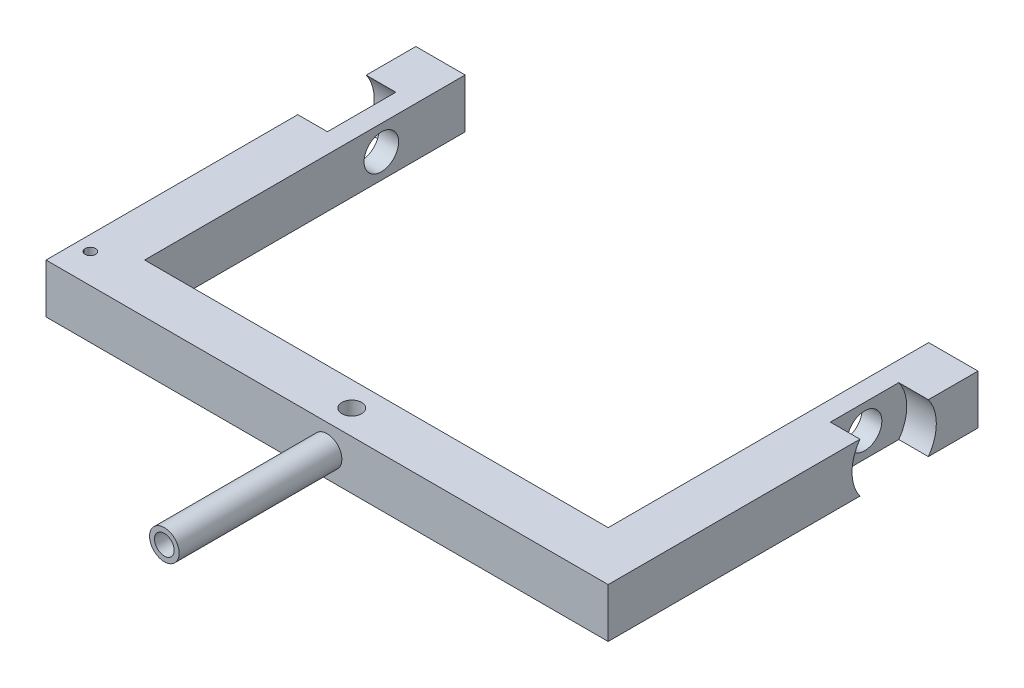
ISO-10303-21;
HEADER;
FILE_DESCRIPTION(('STEP AP214'),'2;1');
FILE_NAME('part.step','',(''),(''),'','','');
FILE_SCHEMA(('AUTOMOTIVE_DESIGN { 1 0 10303 214 1 1 1 1 }'));
ENDSEC;
DATA;
#1=APPLICATION_CONTEXT('core data for automotive mechanical design processes');
#2=APPLICATION_PROTOCOL_DEFINITION('international standard','automotive_design',2000,#1);
#3=PRODUCT_CONTEXT('',#1,'mechanical');
#4=PRODUCT('Part','Part','',(#3));
#5=PRODUCT_RELATED_PRODUCT_CATEGORY('part','',(#4));
#6=PRODUCT_DEFINITION_FORMATION('','',#4);
#7=PRODUCT_DEFINITION_CONTEXT('part definition',#1,'design');
#8=PRODUCT_DEFINITION('design','',#6,#7);
#9=PRODUCT_DEFINITION_SHAPE('','',#8);
#10=(LENGTH_UNIT() NAMED_UNIT(*) SI_UNIT(.MILLI.,.METRE.));
#11=(NAMED_UNIT(*) PLANE_ANGLE_UNIT() SI_UNIT($,.RADIAN.));
#12=(NAMED_UNIT(*) SI_UNIT($,.STERADIAN.) SOLID_ANGLE_UNIT());
#13=UNCERTAINTY_MEASURE_WITH_UNIT(LENGTH_MEASURE(1.E-05),#10,'distance_accuracy_value','');
#14=(GEOMETRIC_REPRESENTATION_CONTEXT(3) GLOBAL_UNCERTAINTY_ASSIGNED_CONTEXT((#13)) GLOBAL_UNIT_ASSIGNED_CONTEXT((#10,
#11,#12)) REPRESENTATION_CONTEXT('',''));
#15=CARTESIAN_POINT('',(0.,0.,0.));
#16=DIRECTION('',(0.,0.,1.));
#17=DIRECTION('',(1.,0.,0.));
#18=AXIS2_PLACEMENT_3D('',#15,#16,#17);
#19=CARTESIAN_POINT('',(-57.,10.,10.));
#20=DIRECTION('',(1.,0.,0.));
#21=DIRECTION('',(0.,0.,-1.));
#22=AXIS2_PLACEMENT_3D('',#19,#20,#21);
#23=PLANE('',#22);
#24=CARTESIAN_POINT('',(-57.,5.,-48.));
#25=DIRECTION('',(1.,0.,0.));
#26=DIRECTION('',(0.,0.,-1.));
#27=AXIS2_PLACEMENT_3D('',#24,#25,#26);
#28=CIRCLE('',#27,8.55);
#29=CARTESIAN_POINT('',(-57.,10.,-41.0644034142693));
#30=VERTEX_POINT('',#29);
#31=CARTESIAN_POINT('',(-57.,0.,-41.0644034142693));
#32=VERTEX_POINT('',#31);
#33=EDGE_CURVE('E175',#30,#32,#28,.T.);
#34=ORIENTED_EDGE('',*,*,#33,.T.);
#35=DIRECTION('',(0.,0.,1.));
#36=VECTOR('',#35,1.);
#37=CARTESIAN_POINT('',(-57.,0.,10.));
#38=LINE('',#37,#36);
#39=CARTESIAN_POINT('',(-57.,0.,10.));
#40=VERTEX_POINT('',#39);
#41=EDGE_CURVE('E206',#32,#40,#38,.T.);
#42=ORIENTED_EDGE('',*,*,#41,.T.);
#43=DIRECTION('',(0.,-1.,0.));
#44=VECTOR('',#43,1.);
#45=CARTESIAN_POINT('',(-57.,10.,10.));
#46=LINE('',#45,#44);
#47=CARTESIAN_POINT('',(-57.,10.,10.));
#48=VERTEX_POINT('',#47);
#49=EDGE_CURVE('E235',#48,#40,#46,.T.);
#50=ORIENTED_EDGE('',*,*,#49,.F.);
#51=DIRECTION('',(0.,0.,1.));
#52=VECTOR('',#51,1.);
#53=CARTESIAN_POINT('',(-57.,10.,10.));
#54=LINE('',#53,#52);
#55=EDGE_CURVE('E183',#30,#48,#54,.T.);
#56=ORIENTED_EDGE('',*,*,#55,.F.);
#57=EDGE_LOOP('',(#34,#42,#50,#56));
#58=FACE_BOUND('',#57,.T.);
#59=ADVANCED_FACE('F33',(#58),#23,.F.);
#60=CARTESIAN_POINT('',(0.,10.,0.));
#61=DIRECTION('',(0.,1.,0.));
#62=DIRECTION('',(0.,0.,1.));
#63=AXIS2_PLACEMENT_3D('',#60,#61,#62);
#64=PLANE('',#63);
#65=CARTESIAN_POINT('',(0.,10.,5.00000000000001));
#66=DIRECTION('',(0.,1.,0.));
#67=DIRECTION('',(0.,0.,1.));
#68=AXIS2_PLACEMENT_3D('',#65,#66,#67);
#69=CIRCLE('',#68,2.);
#70=CARTESIAN_POINT('',(0.,10.,7.00000000000001));
#71=VERTEX_POINT('',#70);
#72=EDGE_CURVE('E414',#71,#71,#69,.T.);
#73=ORIENTED_EDGE('',*,*,#72,.F.);
#74=EDGE_LOOP('',(#73));
#75=FACE_BOUND('',#74,.T.);
#76=CARTESIAN_POINT('',(-54.,10.,4.00000000000001));
#77=DIRECTION('',(0.,1.,0.));
#78=DIRECTION('',(0.,0.,1.));
#79=AXIS2_PLACEMENT_3D('',#76,#77,#78);
#80=CIRCLE('',#79,1.05);
#81=CARTESIAN_POINT('',(-54.,10.,5.05000000000001));
#82=VERTEX_POINT('',#81);
#83=EDGE_CURVE('E405',#82,#82,#80,.T.);
#84=ORIENTED_EDGE('',*,*,#83,.F.);
#85=EDGE_LOOP('',(#84));
#86=FACE_BOUND('',#85,.T.);
#87=CARTESIAN_POINT('',(-57.,10.,-65.));
#88=VERTEX_POINT('',#87);
#89=CARTESIAN_POINT('',(-57.,10.,-54.9355965857308));
#90=VERTEX_POINT('',#89);
#91=EDGE_CURVE('E172',#88,#90,#54,.T.);
#92=ORIENTED_EDGE('',*,*,#91,.T.);
#93=DIRECTION('',(-1.,0.,0.));
#94=VECTOR('',#93,1.);
#95=CARTESIAN_POINT('',(-51.,10.,-54.9355965857308));
#96=LINE('',#95,#94);
#97=CARTESIAN_POINT('',(-51.,10.,-54.9355965857308));
#98=VERTEX_POINT('',#97);
#99=EDGE_CURVE('E154',#90,#98,#96,.F.);
#100=ORIENTED_EDGE('',*,*,#99,.T.);
#101=DIRECTION('',(0.,0.,1.));
#102=VECTOR('',#101,1.);
#103=CARTESIAN_POINT('',(-51.,10.,0.));
#104=LINE('',#103,#102);
#105=CARTESIAN_POINT('',(-51.,10.,-41.0644034142693));
#106=VERTEX_POINT('',#105);
#107=EDGE_CURVE('E372',#98,#106,#104,.T.);
#108=ORIENTED_EDGE('',*,*,#107,.T.);
#109=DIRECTION('',(-1.,0.,0.));
#110=VECTOR('',#109,1.);
#111=CARTESIAN_POINT('',(-51.,10.,-41.0644034142693));
#112=LINE('',#111,#110);
#113=EDGE_CURVE('E165',#106,#30,#112,.T.);
#114=ORIENTED_EDGE('',*,*,#113,.T.);
#115=ORIENTED_EDGE('',*,*,#55,.T.);
#116=DIRECTION('',(1.,0.,0.));
#117=VECTOR('',#116,1.);
#118=CARTESIAN_POINT('',(57.,10.,10.));
#119=LINE('',#118,#117);
#120=CARTESIAN_POINT('',(57.,10.,10.));
#121=VERTEX_POINT('',#120);
#122=EDGE_CURVE('E182',#48,#121,#119,.T.);
#123=ORIENTED_EDGE('',*,*,#122,.T.);
#124=DIRECTION('',(0.,0.,-1.));
#125=VECTOR('',#124,1.);
#126=CARTESIAN_POINT('',(57.,10.,-65.));
#127=LINE('',#126,#125);
#128=CARTESIAN_POINT('',(57.,10.,-41.0644034142693));
#129=VERTEX_POINT('',#128);
#130=EDGE_CURVE('E190',#121,#129,#127,.T.);
#131=ORIENTED_EDGE('',*,*,#130,.T.);
#132=DIRECTION('',(1.,0.,0.));
#133=VECTOR('',#132,1.);
#134=CARTESIAN_POINT('',(51.,10.,-41.0644034142693));
#135=LINE('',#134,#133);
#136=CARTESIAN_POINT('',(51.,10.,-41.0644034142693));
#137=VERTEX_POINT('',#136);
#138=EDGE_CURVE('E204',#137,#129,#135,.T.);
#139=ORIENTED_EDGE('',*,*,#138,.F.);
#140=DIRECTION('',(0.,0.,-1.));
#141=VECTOR('',#140,1.);
#142=CARTESIAN_POINT('',(51.,10.,0.));
#143=LINE('',#142,#141);
#144=CARTESIAN_POINT('',(51.,10.,-54.9355965857308));
#145=VERTEX_POINT('',#144);
#146=EDGE_CURVE('E384',#137,#145,#143,.T.);
#147=ORIENTED_EDGE('',*,*,#146,.T.);
#148=DIRECTION('',(1.,0.,0.));
#149=VECTOR('',#148,1.);
#150=CARTESIAN_POINT('',(51.,10.,-54.9355965857308));
#151=LINE('',#150,#149);
#152=CARTESIAN_POINT('',(57.,10.,-54.9355965857308));
#153=VERTEX_POINT('',#152);
#154=EDGE_CURVE('E386',#153,#145,#151,.F.);
#155=ORIENTED_EDGE('',*,*,#154,.F.);
#156=CARTESIAN_POINT('',(57.,10.,-65.));
#157=VERTEX_POINT('',#156);
#158=EDGE_CURVE('E185',#153,#157,#127,.T.);
#159=ORIENTED_EDGE('',*,*,#158,.T.);
#160=DIRECTION('',(-1.,0.,0.));
#161=VECTOR('',#160,1.);
#162=CARTESIAN_POINT('',(47.,10.,-65.));
#163=LINE('',#162,#161);
#164=CARTESIAN_POINT('',(47.,10.,-65.));
#165=VERTEX_POINT('',#164);
#166=EDGE_CURVE('E193',#157,#165,#163,.T.);
#167=ORIENTED_EDGE('',*,*,#166,.T.);
#168=DIRECTION('',(0.,0.,1.));
#169=VECTOR('',#168,1.);
#170=CARTESIAN_POINT('',(47.,10.,0.));
#171=LINE('',#170,#169);
#172=CARTESIAN_POINT('',(47.,10.,0.));
#173=VERTEX_POINT('',#172);
#174=EDGE_CURVE('E195',#165,#173,#171,.T.);
#175=ORIENTED_EDGE('',*,*,#174,.T.);
#176=DIRECTION('',(-1.,0.,0.));
#177=VECTOR('',#176,1.);
#178=CARTESIAN_POINT('',(-47.,10.,0.));
#179=LINE('',#178,#177);
#180=CARTESIAN_POINT('',(-47.,10.,0.));
#181=VERTEX_POINT('',#180);
#182=EDGE_CURVE('E197',#173,#181,#179,.T.);
#183=ORIENTED_EDGE('',*,*,#182,.T.);
#184=DIRECTION('',(0.,0.,-1.));
#185=VECTOR('',#184,1.);
#186=CARTESIAN_POINT('',(-47.,10.,-65.));
#187=LINE('',#186,#185);
#188=CARTESIAN_POINT('',(-47.,10.,-65.));
#189=VERTEX_POINT('',#188);
#190=EDGE_CURVE('E220',#181,#189,#187,.T.);
#191=ORIENTED_EDGE('',*,*,#190,.T.);
#192=DIRECTION('',(-1.,0.,0.));
#193=VECTOR('',#192,1.);
#194=CARTESIAN_POINT('',(-57.,10.,-65.));
#195=LINE('',#194,#193);
#196=EDGE_CURVE('E180',#189,#88,#195,.T.);
#197=ORIENTED_EDGE('',*,*,#196,.T.);
#198=EDGE_LOOP('',(#92,#100,#108,#114,#115,#123,#131,#139,#147,#155,#159,#167,#175,#183,#191,#197));
#199=FACE_BOUND('',#198,.T.);
#200=ADVANCED_FACE('F178',(#75,#86,#199),#64,.T.);
#201=CARTESIAN_POINT('',(0.,0.,0.));
#202=DIRECTION('',(0.,1.,0.));
#203=DIRECTION('',(0.,0.,1.));
#204=AXIS2_PLACEMENT_3D('',#201,#202,#203);
#205=PLANE('',#204);
#206=CARTESIAN_POINT('',(-54.,0.,4.00000000000001));
#207=DIRECTION('',(0.,1.,0.));
#208=DIRECTION('',(0.,0.,1.));
#209=AXIS2_PLACEMENT_3D('',#206,#207,#208);
#210=CIRCLE('',#209,1.05);
#211=CARTESIAN_POINT('',(-54.,0.,5.05000000000001));
#212=VERTEX_POINT('',#211);
#213=EDGE_CURVE('E404',#212,#212,#210,.T.);
#214=ORIENTED_EDGE('',*,*,#213,.T.);
#215=EDGE_LOOP('',(#214));
#216=FACE_BOUND('',#215,.T.);
#217=DIRECTION('',(-1.,0.,0.));
#218=VECTOR('',#217,1.);
#219=CARTESIAN_POINT('',(-51.,0.,-54.9355965857308));
#220=LINE('',#219,#218);
#221=CARTESIAN_POINT('',(-57.,0.,-54.9355965857308));
#222=VERTEX_POINT('',#221);
#223=CARTESIAN_POINT('',(-51.,0.,-54.9355965857308));
#224=VERTEX_POINT('',#223);
#225=EDGE_CURVE('E255',#222,#224,#220,.F.);
#226=ORIENTED_EDGE('',*,*,#225,.F.);
#227=CARTESIAN_POINT('',(-57.,0.,-65.));
#228=VERTEX_POINT('',#227);
#229=EDGE_CURVE('E174',#228,#222,#38,.T.);
#230=ORIENTED_EDGE('',*,*,#229,.F.);
#231=DIRECTION('',(-1.,0.,0.));
#232=VECTOR('',#231,1.);
#233=CARTESIAN_POINT('',(-57.,0.,-65.));
#234=LINE('',#233,#232);
#235=CARTESIAN_POINT('',(-47.,0.,-65.));
#236=VERTEX_POINT('',#235);
#237=EDGE_CURVE('E203',#236,#228,#234,.T.);
#238=ORIENTED_EDGE('',*,*,#237,.F.);
#239=DIRECTION('',(0.,0.,-1.));
#240=VECTOR('',#239,1.);
#241=CARTESIAN_POINT('',(-47.,0.,-65.));
#242=LINE('',#241,#240);
#243=CARTESIAN_POINT('',(-47.,0.,0.));
#244=VERTEX_POINT('',#243);
#245=EDGE_CURVE('E200',#244,#236,#242,.T.);
#246=ORIENTED_EDGE('',*,*,#245,.F.);
#247=DIRECTION('',(-1.,0.,0.));
#248=VECTOR('',#247,1.);
#249=CARTESIAN_POINT('',(-47.,0.,0.));
#250=LINE('',#249,#248);
#251=CARTESIAN_POINT('',(47.,0.,0.));
#252=VERTEX_POINT('',#251);
#253=EDGE_CURVE('E218',#252,#244,#250,.T.);
#254=ORIENTED_EDGE('',*,*,#253,.F.);
#255=DIRECTION('',(0.,0.,1.));
#256=VECTOR('',#255,1.);
#257=CARTESIAN_POINT('',(47.,0.,0.));
#258=LINE('',#257,#256);
#259=CARTESIAN_POINT('',(47.,0.,-65.));
#260=VERTEX_POINT('',#259);
#261=EDGE_CURVE('E216',#260,#252,#258,.T.);
#262=ORIENTED_EDGE('',*,*,#261,.F.);
#263=DIRECTION('',(-1.,0.,0.));
#264=VECTOR('',#263,1.);
#265=CARTESIAN_POINT('',(47.,0.,-65.));
#266=LINE('',#265,#264);
#267=CARTESIAN_POINT('',(57.,0.,-65.));
#268=VERTEX_POINT('',#267);
#269=EDGE_CURVE('E214',#268,#260,#266,.T.);
#270=ORIENTED_EDGE('',*,*,#269,.F.);
#271=DIRECTION('',(0.,0.,-1.));
#272=VECTOR('',#271,1.);
#273=CARTESIAN_POINT('',(57.,0.,-65.));
#274=LINE('',#273,#272);
#275=CARTESIAN_POINT('',(57.,0.,-54.9355965857308));
#276=VERTEX_POINT('',#275);
#277=EDGE_CURVE('E210',#276,#268,#274,.T.);
#278=ORIENTED_EDGE('',*,*,#277,.F.);
#279=DIRECTION('',(1.,0.,0.));
#280=VECTOR('',#279,1.);
#281=CARTESIAN_POINT('',(51.,0.,-54.9355965857308));
#282=LINE('',#281,#280);
#283=CARTESIAN_POINT('',(51.,0.,-54.9355965857308));
#284=VERTEX_POINT('',#283);
#285=EDGE_CURVE('E245',#276,#284,#282,.F.);
#286=ORIENTED_EDGE('',*,*,#285,.T.);
#287=DIRECTION('',(0.,0.,-1.));
#288=VECTOR('',#287,1.);
#289=CARTESIAN_POINT('',(51.,0.,0.));
#290=LINE('',#289,#288);
#291=CARTESIAN_POINT('',(51.,0.,-41.0644034142693));
#292=VERTEX_POINT('',#291);
#293=EDGE_CURVE('E243',#292,#284,#290,.T.);
#294=ORIENTED_EDGE('',*,*,#293,.F.);
#295=DIRECTION('',(1.,0.,0.));
#296=VECTOR('',#295,1.);
#297=CARTESIAN_POINT('',(51.,0.,-41.0644034142693));
#298=LINE('',#297,#296);
#299=CARTESIAN_POINT('',(57.,0.,-41.0644034142693));
#300=VERTEX_POINT('',#299);
#301=EDGE_CURVE('E248',#292,#300,#298,.T.);
#302=ORIENTED_EDGE('',*,*,#301,.T.);
#303=CARTESIAN_POINT('',(57.,0.,10.));
#304=VERTEX_POINT('',#303);
#305=EDGE_CURVE('E211',#304,#300,#274,.T.);
#306=ORIENTED_EDGE('',*,*,#305,.F.);
#307=DIRECTION('',(1.,0.,0.));
#308=VECTOR('',#307,1.);
#309=CARTESIAN_POINT('',(57.,0.,10.));
#310=LINE('',#309,#308);
#311=EDGE_CURVE('E208',#40,#304,#310,.T.);
#312=ORIENTED_EDGE('',*,*,#311,.F.);
#313=ORIENTED_EDGE('',*,*,#41,.F.);
#314=DIRECTION('',(-1.,0.,0.));
#315=VECTOR('',#314,1.);
#316=CARTESIAN_POINT('',(-51.,0.,-41.0644034142693));
#317=LINE('',#316,#315);
#318=CARTESIAN_POINT('',(-51.,0.,-41.0644034142693));
#319=VERTEX_POINT('',#318);
#320=EDGE_CURVE('E253',#319,#32,#317,.T.);
#321=ORIENTED_EDGE('',*,*,#320,.F.);
#322=DIRECTION('',(0.,0.,1.));
#323=VECTOR('',#322,1.);
#324=CARTESIAN_POINT('',(-51.,0.,0.));
#325=LINE('',#324,#323);
#326=EDGE_CURVE('E251',#224,#319,#325,.T.);
#327=ORIENTED_EDGE('',*,*,#326,.F.);
#328=EDGE_LOOP('',(#226,#230,#238,#246,#254,#262,#270,#278,#286,#294,#302,#306,#312,#313,#321,#327));
#329=FACE_BOUND('',#328,.T.);
#330=ADVANCED_FACE('F310',(#216,#329),#205,.F.);
#331=CARTESIAN_POINT('',(57.,10.,-65.));
#332=DIRECTION('',(-1.,0.,0.));
#333=DIRECTION('',(0.,0.,1.));
#334=AXIS2_PLACEMENT_3D('',#331,#332,#333);
#335=PLANE('',#334);
#336=ORIENTED_EDGE('',*,*,#158,.F.);
#337=CARTESIAN_POINT('',(57.,5.,-48.));
#338=DIRECTION('',(1.,0.,0.));
#339=DIRECTION('',(0.,0.,-1.));
#340=AXIS2_PLACEMENT_3D('',#337,#338,#339);
#341=CIRCLE('',#340,8.55);
#342=EDGE_CURVE('E164',#276,#153,#341,.T.);
#343=ORIENTED_EDGE('',*,*,#342,.F.);
#344=ORIENTED_EDGE('',*,*,#277,.T.);
#345=DIRECTION('',(0.,-1.,0.));
#346=VECTOR('',#345,1.);
#347=CARTESIAN_POINT('',(57.,10.,-65.));
#348=LINE('',#347,#346);
#349=EDGE_CURVE('E229',#157,#268,#348,.T.);
#350=ORIENTED_EDGE('',*,*,#349,.F.);
#351=EDGE_LOOP('',(#336,#343,#344,#350));
#352=FACE_BOUND('',#351,.T.);
#353=ADVANCED_FACE('F314',(#352),#335,.F.);
#354=CARTESIAN_POINT('',(-47.,10.,-65.));
#355=DIRECTION('',(-1.,0.,0.));
#356=DIRECTION('',(0.,0.,1.));
#357=AXIS2_PLACEMENT_3D('',#354,#355,#356);
#358=PLANE('',#357);
#359=CARTESIAN_POINT('',(-47.,5.,-48.));
#360=DIRECTION('',(-1.,0.,0.));
#361=DIRECTION('',(0.,0.,1.));
#362=AXIS2_PLACEMENT_3D('',#359,#360,#361);
#363=CIRCLE('',#362,3.5);
#364=CARTESIAN_POINT('',(-47.,5.,-44.5));
#365=VERTEX_POINT('',#364);
#366=EDGE_CURVE('E176',#365,#365,#363,.T.);
#367=ORIENTED_EDGE('',*,*,#366,.T.);
#368=EDGE_LOOP('',(#367));
#369=FACE_BOUND('',#368,.T.);
#370=ORIENTED_EDGE('',*,*,#245,.T.);
#371=DIRECTION('',(0.,-1.,0.));
#372=VECTOR('',#371,1.);
#373=CARTESIAN_POINT('',(-47.,10.,-65.));
#374=LINE('',#373,#372);
#375=EDGE_CURVE('E240',#189,#236,#374,.T.);
#376=ORIENTED_EDGE('',*,*,#375,.F.);
#377=ORIENTED_EDGE('',*,*,#190,.F.);
#378=DIRECTION('',(0.,-1.,0.));
#379=VECTOR('',#378,1.);
#380=CARTESIAN_POINT('',(-47.,10.,0.));
#381=LINE('',#380,#379);
#382=EDGE_CURVE('E199',#181,#244,#381,.T.);
#383=ORIENTED_EDGE('',*,*,#382,.T.);
#384=EDGE_LOOP('',(#370,#376,#377,#383));
#385=FACE_BOUND('',#384,.T.);
#386=ADVANCED_FACE('F339',(#369,#385),#358,.F.);
#387=CARTESIAN_POINT('',(-57.,10.,-65.));
#388=DIRECTION('',(0.,0.,1.));
#389=DIRECTION('',(1.,0.,0.));
#390=AXIS2_PLACEMENT_3D('',#387,#388,#389);
#391=PLANE('',#390);
#392=ORIENTED_EDGE('',*,*,#237,.T.);
#393=DIRECTION('',(0.,-1.,0.));
#394=VECTOR('',#393,1.);
#395=CARTESIAN_POINT('',(-57.,10.,-65.));
#396=LINE('',#395,#394);
#397=EDGE_CURVE('E238',#88,#228,#396,.T.);
#398=ORIENTED_EDGE('',*,*,#397,.F.);
#399=ORIENTED_EDGE('',*,*,#196,.F.);
#400=ORIENTED_EDGE('',*,*,#375,.T.);
#401=EDGE_LOOP('',(#392,#398,#399,#400));
#402=FACE_BOUND('',#401,.T.);
#403=ADVANCED_FACE('F337',(#402),#391,.F.);
#404=EDGE_CURVE('E158',#222,#90,#28,.T.);
#405=ORIENTED_EDGE('',*,*,#404,.T.);
#406=ORIENTED_EDGE('',*,*,#91,.F.);
#407=ORIENTED_EDGE('',*,*,#397,.T.);
#408=ORIENTED_EDGE('',*,*,#229,.T.);
#409=EDGE_LOOP('',(#405,#406,#407,#408));
#410=FACE_BOUND('',#409,.T.);
#411=ADVANCED_FACE('F170',(#410),#23,.F.);
#412=CARTESIAN_POINT('',(57.,10.,10.));
#413=DIRECTION('',(0.,0.,-1.));
#414=DIRECTION('',(-1.,0.,0.));
#415=AXIS2_PLACEMENT_3D('',#412,#413,#414);
#416=PLANE('',#415);
#417=CARTESIAN_POINT('',(0.,5.,10.));
#418=DIRECTION('',(0.,0.,-1.));
#419=DIRECTION('',(-1.,0.,0.));
#420=AXIS2_PLACEMENT_3D('',#417,#418,#419);
#421=CIRCLE('',#420,3.);
#422=CARTESIAN_POINT('',(-3.,5.,10.));
#423=VERTEX_POINT('',#422);
#424=EDGE_CURVE('E257',#423,#423,#421,.F.);
#425=ORIENTED_EDGE('',*,*,#424,.F.);
#426=EDGE_LOOP('',(#425));
#427=FACE_BOUND('',#426,.T.);
#428=ORIENTED_EDGE('',*,*,#311,.T.);
#429=DIRECTION('',(0.,-1.,0.));
#430=VECTOR('',#429,1.);
#431=CARTESIAN_POINT('',(57.,10.,10.));
#432=LINE('',#431,#430);
#433=EDGE_CURVE('E232',#121,#304,#432,.T.);
#434=ORIENTED_EDGE('',*,*,#433,.F.);
#435=ORIENTED_EDGE('',*,*,#122,.F.);
#436=ORIENTED_EDGE('',*,*,#49,.T.);
#437=EDGE_LOOP('',(#428,#434,#435,#436));
#438=FACE_BOUND('',#437,.T.);
#439=ADVANCED_FACE('F330',(#427,#438),#416,.F.);
#440=ORIENTED_EDGE('',*,*,#305,.T.);
#441=EDGE_CURVE('E369',#129,#300,#341,.T.);
#442=ORIENTED_EDGE('',*,*,#441,.F.);
#443=ORIENTED_EDGE('',*,*,#130,.F.);
#444=ORIENTED_EDGE('',*,*,#433,.T.);
#445=EDGE_LOOP('',(#440,#442,#443,#444));
#446=FACE_BOUND('',#445,.T.);
#447=ADVANCED_FACE('F326',(#446),#335,.F.);
#448=CARTESIAN_POINT('',(47.,10.,-65.));
#449=DIRECTION('',(0.,0.,1.));
#450=DIRECTION('',(1.,0.,0.));
#451=AXIS2_PLACEMENT_3D('',#448,#449,#450);
#452=PLANE('',#451);
#453=ORIENTED_EDGE('',*,*,#269,.T.);
#454=DIRECTION('',(0.,-1.,0.));
#455=VECTOR('',#454,1.);
#456=CARTESIAN_POINT('',(47.,10.,-65.));
#457=LINE('',#456,#455);
#458=EDGE_CURVE('E226',#165,#260,#457,.T.);
#459=ORIENTED_EDGE('',*,*,#458,.F.);
#460=ORIENTED_EDGE('',*,*,#166,.F.);
#461=ORIENTED_EDGE('',*,*,#349,.T.);
#462=EDGE_LOOP('',(#453,#459,#460,#461));
#463=FACE_BOUND('',#462,.T.);
#464=ADVANCED_FACE('F322',(#463),#452,.F.);
#465=CARTESIAN_POINT('',(47.,10.,0.));
#466=DIRECTION('',(1.,0.,0.));
#467=DIRECTION('',(0.,0.,-1.));
#468=AXIS2_PLACEMENT_3D('',#465,#466,#467);
#469=PLANE('',#468);
#470=CARTESIAN_POINT('',(47.,5.,-48.));
#471=DIRECTION('',(1.,0.,0.));
#472=DIRECTION('',(0.,0.,-1.));
#473=AXIS2_PLACEMENT_3D('',#470,#471,#472);
#474=CIRCLE('',#473,3.5);
#475=CARTESIAN_POINT('',(47.,5.,-51.5));
#476=VERTEX_POINT('',#475);
#477=EDGE_CURVE('E261',#476,#476,#474,.T.);
#478=ORIENTED_EDGE('',*,*,#477,.T.);
#479=EDGE_LOOP('',(#478));
#480=FACE_BOUND('',#479,.T.);
#481=ORIENTED_EDGE('',*,*,#261,.T.);
#482=DIRECTION('',(0.,-1.,0.));
#483=VECTOR('',#482,1.);
#484=CARTESIAN_POINT('',(47.,10.,0.));
#485=LINE('',#484,#483);
#486=EDGE_CURVE('E223',#173,#252,#485,.T.);
#487=ORIENTED_EDGE('',*,*,#486,.F.);
#488=ORIENTED_EDGE('',*,*,#174,.F.);
#489=ORIENTED_EDGE('',*,*,#458,.T.);
#490=EDGE_LOOP('',(#481,#487,#488,#489));
#491=FACE_BOUND('',#490,.T.);
#492=ADVANCED_FACE('F318',(#480,#491),#469,.F.);
#493=CARTESIAN_POINT('',(-47.,10.,0.));
#494=DIRECTION('',(0.,0.,1.));
#495=DIRECTION('',(1.,0.,0.));
#496=AXIS2_PLACEMENT_3D('',#493,#494,#495);
#497=PLANE('',#496);
#498=ORIENTED_EDGE('',*,*,#253,.T.);
#499=ORIENTED_EDGE('',*,*,#382,.F.);
#500=ORIENTED_EDGE('',*,*,#182,.F.);
#501=ORIENTED_EDGE('',*,*,#486,.T.);
#502=EDGE_LOOP('',(#498,#499,#500,#501));
#503=FACE_BOUND('',#502,.T.);
#504=ADVANCED_FACE('F306',(#503),#497,.F.);
#505=CARTESIAN_POINT('',(51.,5.,-48.));
#506=DIRECTION('',(1.,0.,0.));
#507=DIRECTION('',(0.,0.,-1.));
#508=AXIS2_PLACEMENT_3D('',#505,#506,#507);
#509=CYLINDRICAL_SURFACE('',#508,8.55);
#510=ORIENTED_EDGE('',*,*,#138,.T.);
#511=ORIENTED_EDGE('',*,*,#441,.T.);
#512=ORIENTED_EDGE('',*,*,#301,.F.);
#513=CARTESIAN_POINT('',(51.,5.,-48.));
#514=DIRECTION('',(1.,0.,0.));
#515=DIRECTION('',(0.,0.,-1.));
#516=AXIS2_PLACEMENT_3D('',#513,#514,#515);
#517=CIRCLE('',#516,8.55);
#518=EDGE_CURVE('E382',#137,#292,#517,.T.);
#519=ORIENTED_EDGE('',*,*,#518,.F.);
#520=EDGE_LOOP('',(#510,#511,#512,#519));
#521=FACE_BOUND('',#520,.T.);
#522=ADVANCED_FACE('F303',(#521),#509,.F.);
#523=ORIENTED_EDGE('',*,*,#154,.T.);
#524=EDGE_CURVE('E379',#284,#145,#517,.T.);
#525=ORIENTED_EDGE('',*,*,#524,.F.);
#526=ORIENTED_EDGE('',*,*,#285,.F.);
#527=ORIENTED_EDGE('',*,*,#342,.T.);
#528=EDGE_LOOP('',(#523,#525,#526,#527));
#529=FACE_BOUND('',#528,.T.);
#530=ADVANCED_FACE('F301',(#529),#509,.F.);
#531=CARTESIAN_POINT('',(51.,5.,-48.));
#532=DIRECTION('',(1.,0.,0.));
#533=DIRECTION('',(0.,0.,-1.));
#534=AXIS2_PLACEMENT_3D('',#531,#532,#533);
#535=PLANE('',#534);
#536=CARTESIAN_POINT('',(51.,5.,-48.));
#537=DIRECTION('',(1.,0.,0.));
#538=DIRECTION('',(0.,0.,-1.));
#539=AXIS2_PLACEMENT_3D('',#536,#537,#538);
#540=CIRCLE('',#539,3.5);
#541=CARTESIAN_POINT('',(51.,5.,-51.5));
#542=VERTEX_POINT('',#541);
#543=EDGE_CURVE('E262',#542,#542,#540,.T.);
#544=ORIENTED_EDGE('',*,*,#543,.F.);
#545=EDGE_LOOP('',(#544));
#546=FACE_BOUND('',#545,.T.);
#547=ORIENTED_EDGE('',*,*,#518,.T.);
#548=ORIENTED_EDGE('',*,*,#293,.T.);
#549=ORIENTED_EDGE('',*,*,#524,.T.);
#550=ORIENTED_EDGE('',*,*,#146,.F.);
#551=EDGE_LOOP('',(#547,#548,#549,#550));
#552=FACE_BOUND('',#551,.T.);
#553=ADVANCED_FACE('F298',(#546,#552),#535,.T.);
#554=CARTESIAN_POINT('',(-51.,5.,-48.));
#555=DIRECTION('',(-1.,0.,0.));
#556=DIRECTION('',(0.,0.,1.));
#557=AXIS2_PLACEMENT_3D('',#554,#555,#556);
#558=CYLINDRICAL_SURFACE('',#557,8.55);
#559=ORIENTED_EDGE('',*,*,#404,.F.);
#560=ORIENTED_EDGE('',*,*,#225,.T.);
#561=CARTESIAN_POINT('',(-51.,5.,-48.));
#562=DIRECTION('',(1.,0.,0.));
#563=DIRECTION('',(0.,0.,-1.));
#564=AXIS2_PLACEMENT_3D('',#561,#562,#563);
#565=CIRCLE('',#564,8.55);
#566=EDGE_CURVE('E160',#224,#98,#565,.T.);
#567=ORIENTED_EDGE('',*,*,#566,.T.);
#568=ORIENTED_EDGE('',*,*,#99,.F.);
#569=EDGE_LOOP('',(#559,#560,#567,#568));
#570=FACE_BOUND('',#569,.T.);
#571=ADVANCED_FACE('F156',(#570),#558,.F.);
#572=EDGE_CURVE('E376',#106,#319,#565,.T.);
#573=ORIENTED_EDGE('',*,*,#572,.T.);
#574=ORIENTED_EDGE('',*,*,#320,.T.);
#575=ORIENTED_EDGE('',*,*,#33,.F.);
#576=ORIENTED_EDGE('',*,*,#113,.F.);
#577=EDGE_LOOP('',(#573,#574,#575,#576));
#578=FACE_BOUND('',#577,.T.);
#579=ADVANCED_FACE('F294',(#578),#558,.F.);
#580=CARTESIAN_POINT('',(-51.,5.,-48.));
#581=DIRECTION('',(-1.,0.,0.));
#582=DIRECTION('',(0.,0.,-1.));
#583=AXIS2_PLACEMENT_3D('',#580,#581,#582);
#584=PLANE('',#583);
#585=CARTESIAN_POINT('',(-51.,5.,-48.));
#586=DIRECTION('',(-1.,0.,0.));
#587=DIRECTION('',(0.,0.,1.));
#588=AXIS2_PLACEMENT_3D('',#585,#586,#587);
#589=CIRCLE('',#588,3.5);
#590=CARTESIAN_POINT('',(-51.,5.,-44.5));
#591=VERTEX_POINT('',#590);
#592=EDGE_CURVE('E258',#591,#591,#589,.T.);
#593=ORIENTED_EDGE('',*,*,#592,.F.);
#594=EDGE_LOOP('',(#593));
#595=FACE_BOUND('',#594,.T.);
#596=ORIENTED_EDGE('',*,*,#566,.F.);
#597=ORIENTED_EDGE('',*,*,#326,.T.);
#598=ORIENTED_EDGE('',*,*,#572,.F.);
#599=ORIENTED_EDGE('',*,*,#107,.F.);
#600=EDGE_LOOP('',(#596,#597,#598,#599));
#601=FACE_BOUND('',#600,.T.);
#602=ADVANCED_FACE('F290',(#595,#601),#584,.T.);
#603=CARTESIAN_POINT('',(-57.,5.,-48.));
#604=DIRECTION('',(1.,0.,0.));
#605=DIRECTION('',(0.,0.,-1.));
#606=AXIS2_PLACEMENT_3D('',#603,#604,#605);
#607=CYLINDRICAL_SURFACE('',#606,3.5);
#608=ORIENTED_EDGE('',*,*,#592,.T.);
#609=EDGE_LOOP('',(#608));
#610=FACE_BOUND('',#609,.T.);
#611=ORIENTED_EDGE('',*,*,#366,.F.);
#612=EDGE_LOOP('',(#611));
#613=FACE_BOUND('',#612,.T.);
#614=ADVANCED_FACE('F287',(#610,#613),#607,.F.);
#615=ORIENTED_EDGE('',*,*,#543,.T.);
#616=EDGE_LOOP('',(#615));
#617=FACE_BOUND('',#616,.T.);
#618=ORIENTED_EDGE('',*,*,#477,.F.);
#619=EDGE_LOOP('',(#618));
#620=FACE_BOUND('',#619,.T.);
#621=ADVANCED_FACE('F285',(#617,#620),#607,.F.);
#622=CARTESIAN_POINT('',(0.,5.,43.));
#623=DIRECTION('',(0.,0.,-1.));
#624=DIRECTION('',(-1.,0.,0.));
#625=AXIS2_PLACEMENT_3D('',#622,#623,#624);
#626=CYLINDRICAL_SURFACE('',#625,3.);
#627=CARTESIAN_POINT('',(0.,5.,43.));
#628=DIRECTION('',(0.,0.,1.));
#629=DIRECTION('',(1.,0.,0.));
#630=AXIS2_PLACEMENT_3D('',#627,#628,#629);
#631=CIRCLE('',#630,3.);
#632=CARTESIAN_POINT('',(3.,5.,43.));
#633=VERTEX_POINT('',#632);
#634=EDGE_CURVE('E401',#633,#633,#631,.T.);
#635=ORIENTED_EDGE('',*,*,#634,.F.);
#636=EDGE_LOOP('',(#635));
#637=FACE_BOUND('',#636,.T.);
#638=ORIENTED_EDGE('',*,*,#424,.T.);
#639=EDGE_LOOP('',(#638));
#640=FACE_BOUND('',#639,.T.);
#641=ADVANCED_FACE('F281',(#637,#640),#626,.T.);
#642=CARTESIAN_POINT('',(0.,5.,43.));
#643=DIRECTION('',(0.,0.,1.));
#644=DIRECTION('',(1.,0.,0.));
#645=AXIS2_PLACEMENT_3D('',#642,#643,#644);
#646=PLANE('',#645);
#647=CARTESIAN_POINT('',(0.,5.,43.));
#648=DIRECTION('',(0.,0.,1.));
#649=DIRECTION('',(1.,0.,0.));
#650=AXIS2_PLACEMENT_3D('',#647,#648,#649);
#651=CIRCLE('',#650,2.);
#652=CARTESIAN_POINT('',(2.,5.,43.));
#653=VERTEX_POINT('',#652);
#654=EDGE_CURVE('E408',#653,#653,#651,.T.);
#655=ORIENTED_EDGE('',*,*,#654,.F.);
#656=EDGE_LOOP('',(#655));
#657=FACE_BOUND('',#656,.T.);
#658=ORIENTED_EDGE('',*,*,#634,.T.);
#659=EDGE_LOOP('',(#658));
#660=FACE_BOUND('',#659,.T.);
#661=ADVANCED_FACE('F277',(#657,#660),#646,.T.);
#662=CARTESIAN_POINT('',(-54.,0.,4.00000000000001));
#663=DIRECTION('',(0.,1.,0.));
#664=DIRECTION('',(0.,0.,1.));
#665=AXIS2_PLACEMENT_3D('',#662,#663,#664);
#666=CYLINDRICAL_SURFACE('',#665,1.05);
#667=ORIENTED_EDGE('',*,*,#213,.F.);
#668=EDGE_LOOP('',(#667));
#669=FACE_BOUND('',#668,.T.);
#670=ORIENTED_EDGE('',*,*,#83,.T.);
#671=EDGE_LOOP('',(#670));
#672=FACE_BOUND('',#671,.T.);
#673=ADVANCED_FACE('F273',(#669,#672),#666,.F.);
#674=CARTESIAN_POINT('',(0.,5.,5.00000000000001));
#675=DIRECTION('',(0.,0.,1.));
#676=DIRECTION('',(1.,0.,0.));
#677=AXIS2_PLACEMENT_3D('',#674,#675,#676);
#678=CYLINDRICAL_SURFACE('',#677,2.);
#679=CARTESIAN_POINT('',(0.,5.,5.00000000000001));
#680=DIRECTION('',(0.,-0.707106781186547,0.707106781186547));
#681=DIRECTION('',(0.,0.707106781186547,0.707106781186547));
#682=AXIS2_PLACEMENT_3D('',#679,#680,#681);
#683=ELLIPSE('',#682,2.82842712474619,2.);
#684=CARTESIAN_POINT('',(-0.954823672429339,3.24264068711929,3.24264068711929));
#685=VERTEX_POINT('',#684);
#686=CARTESIAN_POINT('',(0.954823672429339,3.24264068711929,3.24264068711929));
#687=VERTEX_POINT('',#686);
#688=EDGE_CURVE('E52',#685,#687,#683,.F.);
#689=ORIENTED_EDGE('',*,*,#688,.T.);
#690=CARTESIAN_POINT('',(0.954823672429339,3.24264068711929,3.24264068711929));
#691=CARTESIAN_POINT('',(0.919796172194563,3.22360848394079,3.26167320452531));
#692=CARTESIAN_POINT('',(0.883761849010016,3.2053889279493,3.27963643177413));
#693=CARTESIAN_POINT('',(0.809782606699233,3.17081372947682,3.31333913258288));
#694=CARTESIAN_POINT('',(0.771836669590255,3.15445909557007,3.32907740395038));
#695=CARTESIAN_POINT('',(0.655275608905097,3.10855339705234,3.3728236428109));
#696=CARTESIAN_POINT('',(0.573999844307065,3.08219520502801,3.39732891047843));
#697=CARTESIAN_POINT('',(0.411464031777684,3.04109410089139,3.43512107567683));
#698=CARTESIAN_POINT('',(0.33048678396364,3.02575692447233,3.44898525487646));
#699=CARTESIAN_POINT('',(0.166340042478413,3.00521761104215,3.46748534741148));
#700=CARTESIAN_POINT('',(0.0831743682665482,2.99999886764323,3.47213638164691));
#701=CARTESIAN_POINT('',(-0.0881495031979339,3.0000012000895,3.47213550283205));
#702=CARTESIAN_POINT('',(-0.176308771639514,3.00586541351537,3.466910486237));
#703=CARTESIAN_POINT('',(-0.350034249141792,3.02891541539131,3.44613035325526));
#704=CARTESIAN_POINT('',(-0.435595112925709,3.04612307996237,3.43055527605622));
#705=CARTESIAN_POINT('',(-0.597071005599269,3.08947245950533,3.39056082873936));
#706=CARTESIAN_POINT('',(-0.673257227951994,3.11508610697099,3.36666003052894));
#707=CARTESIAN_POINT('',(-0.782680534704373,3.15908722388938,3.32462726831346));
#708=CARTESIAN_POINT('',(-0.81831059401991,3.17466500473286,3.3096051819076));
#709=CARTESIAN_POINT('',(-0.887866874690965,3.20746843518963,3.2775852200724));
#710=CARTESIAN_POINT('',(-0.921793729679226,3.22469346495442,3.26058808732571));
#711=CARTESIAN_POINT('',(-0.954823672429336,3.24264068711929,3.24264068711929));
#712=B_SPLINE_CURVE_WITH_KNOTS('',3,(#690,#691,#692,#693,#694,#695,#696,#697,#698,#699,#700,
#701,#702,#703,#704,#705,#706,#707,#708,#709,#710,#711),.UNSPECIFIED.,.F.,.F.,(4,2,2,2,2,2,2,2,
2,2,4),(0.,0.132461389171655,0.264994078806159,0.530294585571138,0.779920032774855,
1.02913544636185,1.29325785997081,1.55789113609822,1.80834582681484,1.93330977824929,
2.05822689025827),.UNSPECIFIED.);
#713=EDGE_CURVE('E46',#687,#685,#712,.T.);
#714=ORIENTED_EDGE('',*,*,#713,.T.);
#715=EDGE_LOOP('',(#689,#714));
#716=FACE_BOUND('',#715,.T.);
#717=ORIENTED_EDGE('',*,*,#654,.T.);
#718=EDGE_LOOP('',(#717));
#719=FACE_BOUND('',#718,.T.);
#720=ADVANCED_FACE('F268',(#716,#719),#678,.F.);
#721=CARTESIAN_POINT('',(0.,5.,5.00000000000001));
#722=DIRECTION('',(0.,1.,0.));
#723=DIRECTION('',(0.,0.,1.));
#724=AXIS2_PLACEMENT_3D('',#721,#722,#723);
#725=CYLINDRICAL_SURFACE('',#724,2.);
#726=ORIENTED_EDGE('',*,*,#72,.T.);
#727=EDGE_LOOP('',(#726));
#728=FACE_BOUND('',#727,.T.);
#729=ORIENTED_EDGE('',*,*,#688,.F.);
#730=CARTESIAN_POINT('',(-0.954823672429339,3.24264068711929,3.24264068711929));
#731=CARTESIAN_POINT('',(-0.919796172194563,3.2616732045253,3.2236084839408));
#732=CARTESIAN_POINT('',(-0.883761849010015,3.27963643177412,3.20538892794931));
#733=CARTESIAN_POINT('',(-0.809782606699232,3.31333913258287,3.17081372947682));
#734=CARTESIAN_POINT('',(-0.771836669590255,3.32907740395037,3.15445909557008));
#735=CARTESIAN_POINT('',(-0.655275608905097,3.3728236428109,3.10855339705235));
#736=CARTESIAN_POINT('',(-0.573999844307065,3.39732891047842,3.08219520502802));
#737=CARTESIAN_POINT('',(-0.411464031777684,3.43512107567682,3.04109410089139));
#738=CARTESIAN_POINT('',(-0.33048678396364,3.44898525487645,3.02575692447234));
#739=CARTESIAN_POINT('',(-0.166340042478413,3.46748534741147,3.00521761104216));
#740=CARTESIAN_POINT('',(-0.0831743682665484,3.4721363816469,2.99999886764324));
#741=CARTESIAN_POINT('',(0.0881495031979337,3.47213550283204,3.00000120008951));
#742=CARTESIAN_POINT('',(0.176308771639513,3.46691048623699,3.00586541351538));
#743=CARTESIAN_POINT('',(0.350034249141792,3.44613035325525,3.02891541539132));
#744=CARTESIAN_POINT('',(0.435595112925709,3.43055527605621,3.04612307996238));
#745=CARTESIAN_POINT('',(0.597071005599269,3.39056082873935,3.08947245950534));
#746=CARTESIAN_POINT('',(0.673257227951994,3.36666003052893,3.11508610697099));
#747=CARTESIAN_POINT('',(0.782680534704372,3.32462726831345,3.15908722388939));
#748=CARTESIAN_POINT('',(0.81831059401991,3.30960518190759,3.17466500473287));
#749=CARTESIAN_POINT('',(0.887866874690965,3.27758522007239,3.20746843518964));
#750=CARTESIAN_POINT('',(0.921793729679226,3.2605880873257,3.22469346495443));
#751=CARTESIAN_POINT('',(0.954823672429336,3.24264068711928,3.2426406871193));
#752=B_SPLINE_CURVE_WITH_KNOTS('',3,(#730,#731,#732,#733,#734,#735,#736,#737,#738,#739,#740,
#741,#742,#743,#744,#745,#746,#747,#748,#749,#750,#751),.UNSPECIFIED.,.F.,.F.,(4,2,2,2,2,2,2,2,
2,2,4),(0.,0.132461389171655,0.26499407880616,0.530294585571139,0.779920032774855,
1.02913544636185,1.29325785997081,1.55789113609822,1.80834582681484,1.93330977824929,
2.05822689025827),.UNSPECIFIED.);
#753=EDGE_CURVE('E11',#685,#687,#752,.T.);
#754=ORIENTED_EDGE('',*,*,#753,.T.);
#755=EDGE_LOOP('',(#729,#754));
#756=FACE_BOUND('',#755,.T.);
#757=ADVANCED_FACE('F272',(#728,#756),#725,.F.);
#758=CARTESIAN_POINT('',(0.,-1.,-0.999999999999989));
#759=DIRECTION('',(-1.,0.,0.));
#760=DIRECTION('',(0.,0.,1.));
#761=AXIS2_PLACEMENT_3D('',#758,#759,#760);
#762=CYLINDRICAL_SURFACE('',#761,6.);
#763=ORIENTED_EDGE('',*,*,#713,.F.);
#764=ORIENTED_EDGE('',*,*,#753,.F.);
#765=EDGE_LOOP('',(#763,#764));
#766=FACE_BOUND('',#765,.T.);
#767=ADVANCED_FACE('F35',(#766),#762,.T.);
#768=CLOSED_SHELL('',(#59,#200,#330,#353,#386,#403,#411,#439,#447,#464,#492,#504,#522,#530,#553,
#571,#579,#602,#614,#621,#641,#661,#673,#720,#757,#767));
#769=MANIFOLD_SOLID_BREP('B2',#768);
#770=ADVANCED_BREP_SHAPE_REPRESENTATION('',(#18,#769),#14);
#771=SHAPE_DEFINITION_REPRESENTATION(#9,#770);
ENDSEC;
END-ISO-10303-21;
